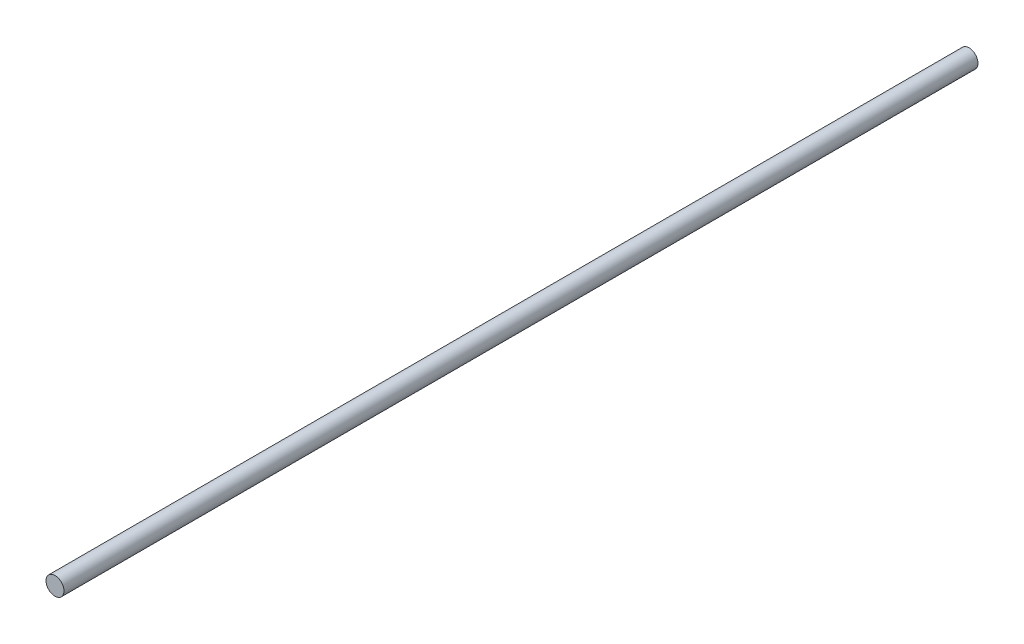
ISO-10303-21;
HEADER;
FILE_DESCRIPTION(('STEP AP214'),'2;1');
FILE_NAME('part.step','',(''),(''),'','','');
FILE_SCHEMA(('AUTOMOTIVE_DESIGN { 1 0 10303 214 1 1 1 1 }'));
ENDSEC;
DATA;
#1=APPLICATION_CONTEXT('core data for automotive mechanical design processes');
#2=APPLICATION_PROTOCOL_DEFINITION('international standard','automotive_design',2000,#1);
#3=PRODUCT_CONTEXT('',#1,'mechanical');
#4=PRODUCT('Part','Part','',(#3));
#5=PRODUCT_RELATED_PRODUCT_CATEGORY('part','',(#4));
#6=PRODUCT_DEFINITION_FORMATION('','',#4);
#7=PRODUCT_DEFINITION_CONTEXT('part definition',#1,'design');
#8=PRODUCT_DEFINITION('design','',#6,#7);
#9=PRODUCT_DEFINITION_SHAPE('','',#8);
#10=(LENGTH_UNIT() NAMED_UNIT(*) SI_UNIT(.MILLI.,.METRE.));
#11=(NAMED_UNIT(*) PLANE_ANGLE_UNIT() SI_UNIT($,.RADIAN.));
#12=(NAMED_UNIT(*) SI_UNIT($,.STERADIAN.) SOLID_ANGLE_UNIT());
#13=UNCERTAINTY_MEASURE_WITH_UNIT(LENGTH_MEASURE(1.E-05),#10,'distance_accuracy_value','');
#14=(GEOMETRIC_REPRESENTATION_CONTEXT(3) GLOBAL_UNCERTAINTY_ASSIGNED_CONTEXT((#13)) GLOBAL_UNIT_ASSIGNED_CONTEXT((#10,
#11,#12)) REPRESENTATION_CONTEXT('',''));
#15=CARTESIAN_POINT('',(0.,0.,0.));
#16=DIRECTION('',(0.,0.,1.));
#17=DIRECTION('',(1.,0.,0.));
#18=AXIS2_PLACEMENT_3D('',#15,#16,#17);
#19=CARTESIAN_POINT('',(1299.8728410236,107.13073777059,-621.970562748476));
#20=DIRECTION('',(0.,0.,1.));
#21=DIRECTION('',(1.,0.,0.));
#22=AXIS2_PLACEMENT_3D('',#19,#20,#21);
#23=CYLINDRICAL_SURFACE('',#22,5.99999999999987);
#24=CARTESIAN_POINT('',(1299.8728410236,107.13073777059,-605.));
#25=DIRECTION('',(0.,0.,1.));
#26=DIRECTION('',(1.,0.,0.));
#27=AXIS2_PLACEMENT_3D('',#24,#25,#26);
#28=CIRCLE('',#27,5.99999999999987);
#29=CARTESIAN_POINT('',(1305.8728410236,107.13073777059,-605.));
#30=VERTEX_POINT('',#29);
#31=EDGE_CURVE('E10',#30,#30,#28,.F.);
#32=ORIENTED_EDGE('',*,*,#31,.F.);
#33=EDGE_LOOP('',(#32));
#34=FACE_BOUND('',#33,.T.);
#35=CARTESIAN_POINT('',(1299.8728410236,107.13073777059,5.));
#36=DIRECTION('',(0.,0.,1.));
#37=DIRECTION('',(1.,0.,0.));
#38=AXIS2_PLACEMENT_3D('',#35,#36,#37);
#39=CIRCLE('',#38,5.99999999999987);
#40=CARTESIAN_POINT('',(1305.8728410236,107.13073777059,5.));
#41=VERTEX_POINT('',#40);
#42=EDGE_CURVE('E40',#41,#41,#39,.T.);
#43=ORIENTED_EDGE('',*,*,#42,.F.);
#44=EDGE_LOOP('',(#43));
#45=FACE_BOUND('',#44,.T.);
#46=ADVANCED_FACE('F33',(#34,#45),#23,.T.);
#47=CARTESIAN_POINT('',(1299.8728410236,107.13073777059,5.));
#48=DIRECTION('',(0.,0.,1.));
#49=DIRECTION('',(1.,0.,0.));
#50=AXIS2_PLACEMENT_3D('',#47,#48,#49);
#51=PLANE('',#50);
#52=ORIENTED_EDGE('',*,*,#42,.T.);
#53=EDGE_LOOP('',(#52));
#54=FACE_BOUND('',#53,.T.);
#55=ADVANCED_FACE('F46',(#54),#51,.T.);
#56=CARTESIAN_POINT('',(1100.,99.9999999999999,-605.));
#57=DIRECTION('',(0.,0.,1.));
#58=DIRECTION('',(0.998621417530875,-0.0524906129572257,0.));
#59=AXIS2_PLACEMENT_3D('',#56,#57,#58);
#60=PLANE('',#59);
#61=ORIENTED_EDGE('',*,*,#31,.T.);
#62=EDGE_LOOP('',(#61));
#63=FACE_BOUND('',#62,.T.);
#64=ADVANCED_FACE('F53',(#63),#60,.F.);
#65=CLOSED_SHELL('',(#46,#55,#64));
#66=MANIFOLD_SOLID_BREP('B2',#65);
#67=ADVANCED_BREP_SHAPE_REPRESENTATION('',(#18,#66),#14);
#68=SHAPE_DEFINITION_REPRESENTATION(#9,#67);
ENDSEC;
END-ISO-10303-21;
